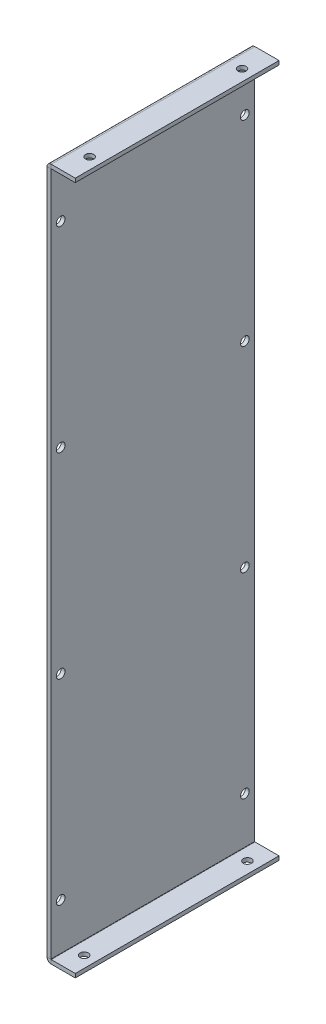
ISO-10303-21;
HEADER;
FILE_DESCRIPTION(('STEP AP214'),'2;1');
FILE_NAME('part.step','',(''),(''),'','','');
FILE_SCHEMA(('AUTOMOTIVE_DESIGN { 1 0 10303 214 1 1 1 1 }'));
ENDSEC;
DATA;
#1=APPLICATION_CONTEXT('core data for automotive mechanical design processes');
#2=APPLICATION_PROTOCOL_DEFINITION('international standard','automotive_design',2000,#1);
#3=PRODUCT_CONTEXT('',#1,'mechanical');
#4=PRODUCT('Part','Part','',(#3));
#5=PRODUCT_RELATED_PRODUCT_CATEGORY('part','',(#4));
#6=PRODUCT_DEFINITION_FORMATION('','',#4);
#7=PRODUCT_DEFINITION_CONTEXT('part definition',#1,'design');
#8=PRODUCT_DEFINITION('design','',#6,#7);
#9=PRODUCT_DEFINITION_SHAPE('','',#8);
#10=(LENGTH_UNIT() NAMED_UNIT(*) SI_UNIT(.MILLI.,.METRE.));
#11=(NAMED_UNIT(*) PLANE_ANGLE_UNIT() SI_UNIT($,.RADIAN.));
#12=(NAMED_UNIT(*) SI_UNIT($,.STERADIAN.) SOLID_ANGLE_UNIT());
#13=UNCERTAINTY_MEASURE_WITH_UNIT(LENGTH_MEASURE(1.E-05),#10,'distance_accuracy_value','');
#14=(GEOMETRIC_REPRESENTATION_CONTEXT(3) GLOBAL_UNCERTAINTY_ASSIGNED_CONTEXT((#13)) GLOBAL_UNIT_ASSIGNED_CONTEXT((#10,
#11,#12)) REPRESENTATION_CONTEXT('',''));
#15=CARTESIAN_POINT('',(0.,0.,0.));
#16=DIRECTION('',(0.,0.,1.));
#17=DIRECTION('',(1.,0.,0.));
#18=AXIS2_PLACEMENT_3D('',#15,#16,#17);
#19=CARTESIAN_POINT('',(0.,2.4384,118.872));
#20=DIRECTION('',(0.,0.,1.));
#21=DIRECTION('',(1.,0.,0.));
#22=AXIS2_PLACEMENT_3D('',#19,#20,#21);
#23=PLANE('',#22);
#24=DIRECTION('',(1.,0.,0.));
#25=VECTOR('',#24,1.);
#26=CARTESIAN_POINT('',(0.,2.4384,118.872));
#27=LINE('',#26,#25);
#28=CARTESIAN_POINT('',(0.,2.4384,118.872));
#29=VERTEX_POINT('',#28);
#30=CARTESIAN_POINT('',(2.286,2.4384,118.872));
#31=VERTEX_POINT('',#30);
#32=EDGE_CURVE('E11',#29,#31,#27,.T.);
#33=ORIENTED_EDGE('',*,*,#32,.F.);
#34=CARTESIAN_POINT('',(2.4384,2.4384,118.872));
#35=DIRECTION('',(0.,0.,1.));
#36=DIRECTION('',(1.,0.,0.));
#37=AXIS2_PLACEMENT_3D('',#34,#35,#36);
#38=CIRCLE('',#37,2.4384);
#39=CARTESIAN_POINT('',(2.4384,0.,118.872));
#40=VERTEX_POINT('',#39);
#41=EDGE_CURVE('E247',#40,#29,#38,.F.);
#42=ORIENTED_EDGE('',*,*,#41,.F.);
#43=DIRECTION('',(0.,-1.,0.));
#44=VECTOR('',#43,1.);
#45=CARTESIAN_POINT('',(2.4384,2.286,118.872));
#46=LINE('',#45,#44);
#47=CARTESIAN_POINT('',(2.4384,2.286,118.872));
#48=VERTEX_POINT('',#47);
#49=EDGE_CURVE('E44',#48,#40,#46,.T.);
#50=ORIENTED_EDGE('',*,*,#49,.F.);
#51=CARTESIAN_POINT('',(2.4384,2.4384,118.872));
#52=DIRECTION('',(0.,0.,1.));
#53=DIRECTION('',(1.,0.,0.));
#54=AXIS2_PLACEMENT_3D('',#51,#52,#53);
#55=CIRCLE('',#54,0.1524);
#56=EDGE_CURVE('E145',#48,#31,#55,.F.);
#57=ORIENTED_EDGE('',*,*,#56,.T.);
#58=EDGE_LOOP('',(#33,#42,#50,#57));
#59=FACE_BOUND('',#58,.T.);
#60=ADVANCED_FACE('F36',(#59),#23,.T.);
#61=CARTESIAN_POINT('',(2.4384,2.286,118.872));
#62=DIRECTION('',(0.,0.,1.));
#63=DIRECTION('',(1.,0.,0.));
#64=AXIS2_PLACEMENT_3D('',#61,#62,#63);
#65=PLANE('',#64);
#66=DIRECTION('',(0.,1.,0.));
#67=VECTOR('',#66,1.);
#68=CARTESIAN_POINT('',(0.,0.,118.872));
#69=LINE('',#68,#67);
#70=CARTESIAN_POINT('',(0.,401.6756,118.872));
#71=VERTEX_POINT('',#70);
#72=EDGE_CURVE('E139',#29,#71,#69,.T.);
#73=ORIENTED_EDGE('',*,*,#72,.F.);
#74=ORIENTED_EDGE('',*,*,#32,.T.);
#75=DIRECTION('',(0.,1.,0.));
#76=VECTOR('',#75,1.);
#77=CARTESIAN_POINT('',(2.286,0.,118.872));
#78=LINE('',#77,#76);
#79=CARTESIAN_POINT('',(2.286,401.6756,118.872));
#80=VERTEX_POINT('',#79);
#81=EDGE_CURVE('E136',#31,#80,#78,.T.);
#82=ORIENTED_EDGE('',*,*,#81,.T.);
#83=DIRECTION('',(-1.,0.,0.));
#84=VECTOR('',#83,1.);
#85=CARTESIAN_POINT('',(2.286,401.6756,118.872));
#86=LINE('',#85,#84);
#87=EDGE_CURVE('E228',#80,#71,#86,.T.);
#88=ORIENTED_EDGE('',*,*,#87,.T.);
#89=EDGE_LOOP('',(#73,#74,#82,#88));
#90=FACE_BOUND('',#89,.T.);
#91=ADVANCED_FACE('F134',(#90),#65,.T.);
#92=CARTESIAN_POINT('',(2.4384,0.,0.));
#93=DIRECTION('',(0.,0.,-1.));
#94=DIRECTION('',(-1.,0.,0.));
#95=AXIS2_PLACEMENT_3D('',#92,#93,#94);
#96=PLANE('',#95);
#97=DIRECTION('',(0.,1.,0.));
#98=VECTOR('',#97,1.);
#99=CARTESIAN_POINT('',(2.4384,0.,0.));
#100=LINE('',#99,#98);
#101=CARTESIAN_POINT('',(2.4384,0.,0.));
#102=VERTEX_POINT('',#101);
#103=CARTESIAN_POINT('',(2.4384,2.286,0.));
#104=VERTEX_POINT('',#103);
#105=EDGE_CURVE('E233',#102,#104,#100,.T.);
#106=ORIENTED_EDGE('',*,*,#105,.F.);
#107=CARTESIAN_POINT('',(2.4384,2.4384,0.));
#108=DIRECTION('',(0.,0.,1.));
#109=DIRECTION('',(1.,0.,0.));
#110=AXIS2_PLACEMENT_3D('',#107,#108,#109);
#111=CIRCLE('',#110,2.4384);
#112=CARTESIAN_POINT('',(0.,2.4384,0.));
#113=VERTEX_POINT('',#112);
#114=EDGE_CURVE('E185',#102,#113,#111,.F.);
#115=ORIENTED_EDGE('',*,*,#114,.T.);
#116=DIRECTION('',(-1.,0.,0.));
#117=VECTOR('',#116,1.);
#118=CARTESIAN_POINT('',(2.286,2.4384,0.));
#119=LINE('',#118,#117);
#120=CARTESIAN_POINT('',(2.286,2.4384,0.));
#121=VERTEX_POINT('',#120);
#122=EDGE_CURVE('E231',#121,#113,#119,.T.);
#123=ORIENTED_EDGE('',*,*,#122,.F.);
#124=CARTESIAN_POINT('',(2.4384,2.4384,0.));
#125=DIRECTION('',(0.,0.,1.));
#126=DIRECTION('',(1.,0.,0.));
#127=AXIS2_PLACEMENT_3D('',#124,#125,#126);
#128=CIRCLE('',#127,0.1524);
#129=EDGE_CURVE('E157',#104,#121,#128,.F.);
#130=ORIENTED_EDGE('',*,*,#129,.F.);
#131=EDGE_LOOP('',(#106,#115,#123,#130));
#132=FACE_BOUND('',#131,.T.);
#133=ADVANCED_FACE('F371',(#132),#96,.T.);
#134=CARTESIAN_POINT('',(2.286,2.4384,0.));
#135=DIRECTION('',(0.,0.,-1.));
#136=DIRECTION('',(-1.,0.,0.));
#137=AXIS2_PLACEMENT_3D('',#134,#135,#136);
#138=PLANE('',#137);
#139=DIRECTION('',(-1.,0.,0.));
#140=VECTOR('',#139,1.);
#141=CARTESIAN_POINT('',(0.,0.,0.));
#142=LINE('',#141,#140);
#143=CARTESIAN_POINT('',(16.51,0.,0.));
#144=VERTEX_POINT('',#143);
#145=EDGE_CURVE('E188',#144,#102,#142,.T.);
#146=ORIENTED_EDGE('',*,*,#145,.T.);
#147=ORIENTED_EDGE('',*,*,#105,.T.);
#148=DIRECTION('',(1.,0.,0.));
#149=VECTOR('',#148,1.);
#150=CARTESIAN_POINT('',(0.,2.286,0.));
#151=LINE('',#150,#149);
#152=CARTESIAN_POINT('',(16.51,2.286,0.));
#153=VERTEX_POINT('',#152);
#154=EDGE_CURVE('E194',#153,#104,#151,.F.);
#155=ORIENTED_EDGE('',*,*,#154,.F.);
#156=DIRECTION('',(0.,-1.,0.));
#157=VECTOR('',#156,1.);
#158=CARTESIAN_POINT('',(16.51,2.286,0.));
#159=LINE('',#158,#157);
#160=EDGE_CURVE('E191',#153,#144,#159,.T.);
#161=ORIENTED_EDGE('',*,*,#160,.T.);
#162=EDGE_LOOP('',(#146,#147,#155,#161));
#163=FACE_BOUND('',#162,.T.);
#164=ADVANCED_FACE('F374',(#163),#138,.T.);
#165=CARTESIAN_POINT('',(2.4384,404.114,118.872));
#166=DIRECTION('',(0.,0.,1.));
#167=DIRECTION('',(1.,0.,0.));
#168=AXIS2_PLACEMENT_3D('',#165,#166,#167);
#169=PLANE('',#168);
#170=DIRECTION('',(0.,-1.,0.));
#171=VECTOR('',#170,1.);
#172=CARTESIAN_POINT('',(2.4384,404.114,118.872));
#173=LINE('',#172,#171);
#174=CARTESIAN_POINT('',(2.4384,404.114,118.872));
#175=VERTEX_POINT('',#174);
#176=CARTESIAN_POINT('',(2.4384,401.828,118.872));
#177=VERTEX_POINT('',#176);
#178=EDGE_CURVE('E52',#175,#177,#173,.T.);
#179=ORIENTED_EDGE('',*,*,#178,.F.);
#180=CARTESIAN_POINT('',(2.4384,401.6756,118.872));
#181=DIRECTION('',(0.,0.,1.));
#182=DIRECTION('',(1.,0.,0.));
#183=AXIS2_PLACEMENT_3D('',#180,#181,#182);
#184=CIRCLE('',#183,2.4384);
#185=EDGE_CURVE('E257',#71,#175,#184,.F.);
#186=ORIENTED_EDGE('',*,*,#185,.F.);
#187=ORIENTED_EDGE('',*,*,#87,.F.);
#188=CARTESIAN_POINT('',(2.4384,401.6756,118.872));
#189=DIRECTION('',(0.,0.,1.));
#190=DIRECTION('',(1.,0.,0.));
#191=AXIS2_PLACEMENT_3D('',#188,#189,#190);
#192=CIRCLE('',#191,0.1524);
#193=EDGE_CURVE('E165',#80,#177,#192,.F.);
#194=ORIENTED_EDGE('',*,*,#193,.T.);
#195=EDGE_LOOP('',(#179,#186,#187,#194));
#196=FACE_BOUND('',#195,.T.);
#197=ADVANCED_FACE('F401',(#196),#169,.T.);
#198=CARTESIAN_POINT('',(2.286,401.6756,118.872));
#199=DIRECTION('',(0.,0.,1.));
#200=DIRECTION('',(1.,0.,0.));
#201=AXIS2_PLACEMENT_3D('',#198,#199,#200);
#202=PLANE('',#201);
#203=DIRECTION('',(1.,0.,0.));
#204=VECTOR('',#203,1.);
#205=CARTESIAN_POINT('',(0.,404.114,118.872));
#206=LINE('',#205,#204);
#207=CARTESIAN_POINT('',(16.51,404.114,118.872));
#208=VERTEX_POINT('',#207);
#209=EDGE_CURVE('E260',#175,#208,#206,.T.);
#210=ORIENTED_EDGE('',*,*,#209,.F.);
#211=ORIENTED_EDGE('',*,*,#178,.T.);
#212=DIRECTION('',(1.,0.,0.));
#213=VECTOR('',#212,1.);
#214=CARTESIAN_POINT('',(0.,401.828,118.872));
#215=LINE('',#214,#213);
#216=CARTESIAN_POINT('',(16.51,401.828,118.872));
#217=VERTEX_POINT('',#216);
#218=EDGE_CURVE('E106',#177,#217,#215,.T.);
#219=ORIENTED_EDGE('',*,*,#218,.T.);
#220=DIRECTION('',(0.,-1.,0.));
#221=VECTOR('',#220,1.);
#222=CARTESIAN_POINT('',(16.51,404.114,118.872));
#223=LINE('',#222,#221);
#224=EDGE_CURVE('E263',#208,#217,#223,.T.);
#225=ORIENTED_EDGE('',*,*,#224,.F.);
#226=EDGE_LOOP('',(#210,#211,#219,#225));
#227=FACE_BOUND('',#226,.T.);
#228=ADVANCED_FACE('F404',(#227),#202,.T.);
#229=CARTESIAN_POINT('',(0.,401.6756,0.));
#230=DIRECTION('',(0.,0.,-1.));
#231=DIRECTION('',(-1.,0.,0.));
#232=AXIS2_PLACEMENT_3D('',#229,#230,#231);
#233=PLANE('',#232);
#234=DIRECTION('',(1.,0.,0.));
#235=VECTOR('',#234,1.);
#236=CARTESIAN_POINT('',(0.,401.6756,0.));
#237=LINE('',#236,#235);
#238=CARTESIAN_POINT('',(0.,401.6756,0.));
#239=VERTEX_POINT('',#238);
#240=CARTESIAN_POINT('',(2.286,401.6756,0.));
#241=VERTEX_POINT('',#240);
#242=EDGE_CURVE('E93',#239,#241,#237,.T.);
#243=ORIENTED_EDGE('',*,*,#242,.F.);
#244=CARTESIAN_POINT('',(2.4384,401.6756,0.));
#245=DIRECTION('',(0.,0.,1.));
#246=DIRECTION('',(1.,0.,0.));
#247=AXIS2_PLACEMENT_3D('',#244,#245,#246);
#248=CIRCLE('',#247,2.4384);
#249=CARTESIAN_POINT('',(2.4384,404.114,0.));
#250=VERTEX_POINT('',#249);
#251=EDGE_CURVE('E181',#239,#250,#248,.F.);
#252=ORIENTED_EDGE('',*,*,#251,.T.);
#253=DIRECTION('',(0.,1.,0.));
#254=VECTOR('',#253,1.);
#255=CARTESIAN_POINT('',(2.4384,401.828,0.));
#256=LINE('',#255,#254);
#257=CARTESIAN_POINT('',(2.4384,401.828,0.));
#258=VERTEX_POINT('',#257);
#259=EDGE_CURVE('E100',#258,#250,#256,.T.);
#260=ORIENTED_EDGE('',*,*,#259,.F.);
#261=CARTESIAN_POINT('',(2.4384,401.6756,0.));
#262=DIRECTION('',(0.,0.,1.));
#263=DIRECTION('',(1.,0.,0.));
#264=AXIS2_PLACEMENT_3D('',#261,#262,#263);
#265=CIRCLE('',#264,0.1524);
#266=EDGE_CURVE('E200',#241,#258,#265,.F.);
#267=ORIENTED_EDGE('',*,*,#266,.F.);
#268=EDGE_LOOP('',(#243,#252,#260,#267));
#269=FACE_BOUND('',#268,.T.);
#270=ADVANCED_FACE('F362',(#269),#233,.T.);
#271=CARTESIAN_POINT('',(2.4384,401.828,0.));
#272=DIRECTION('',(0.,0.,-1.));
#273=DIRECTION('',(-1.,0.,0.));
#274=AXIS2_PLACEMENT_3D('',#271,#272,#273);
#275=PLANE('',#274);
#276=DIRECTION('',(0.,1.,0.));
#277=VECTOR('',#276,1.);
#278=CARTESIAN_POINT('',(0.,0.,0.));
#279=LINE('',#278,#277);
#280=EDGE_CURVE('E183',#113,#239,#279,.T.);
#281=ORIENTED_EDGE('',*,*,#280,.T.);
#282=ORIENTED_EDGE('',*,*,#242,.T.);
#283=DIRECTION('',(0.,1.,0.));
#284=VECTOR('',#283,1.);
#285=CARTESIAN_POINT('',(2.286,0.,0.));
#286=LINE('',#285,#284);
#287=EDGE_CURVE('E198',#121,#241,#286,.T.);
#288=ORIENTED_EDGE('',*,*,#287,.F.);
#289=ORIENTED_EDGE('',*,*,#122,.T.);
#290=EDGE_LOOP('',(#281,#282,#288,#289));
#291=FACE_BOUND('',#290,.T.);
#292=ADVANCED_FACE('F367',(#291),#275,.T.);
#293=CARTESIAN_POINT('',(0.,401.828,118.872));
#294=DIRECTION('',(0.,1.,0.));
#295=DIRECTION('',(0.,0.,1.));
#296=AXIS2_PLACEMENT_3D('',#293,#294,#295);
#297=PLANE('',#296);
#298=CARTESIAN_POINT('',(9.906,401.828,14.986));
#299=DIRECTION('',(0.,1.,0.));
#300=DIRECTION('',(0.,0.,1.));
#301=AXIS2_PLACEMENT_3D('',#298,#299,#300);
#302=CIRCLE('',#301,2.38125);
#303=CARTESIAN_POINT('',(9.906,401.828,17.36725));
#304=VERTEX_POINT('',#303);
#305=EDGE_CURVE('E330',#304,#304,#302,.T.);
#306=ORIENTED_EDGE('',*,*,#305,.T.);
#307=EDGE_LOOP('',(#306));
#308=FACE_BOUND('',#307,.T.);
#309=CARTESIAN_POINT('',(9.906,401.828,103.886));
#310=DIRECTION('',(0.,1.,0.));
#311=DIRECTION('',(0.,0.,1.));
#312=AXIS2_PLACEMENT_3D('',#309,#310,#311);
#313=CIRCLE('',#312,2.38125);
#314=CARTESIAN_POINT('',(9.906,401.828,106.26725));
#315=VERTEX_POINT('',#314);
#316=EDGE_CURVE('E324',#315,#315,#313,.T.);
#317=ORIENTED_EDGE('',*,*,#316,.T.);
#318=EDGE_LOOP('',(#317));
#319=FACE_BOUND('',#318,.T.);
#320=DIRECTION('',(1.,0.,0.));
#321=VECTOR('',#320,1.);
#322=CARTESIAN_POINT('',(0.,401.828,0.));
#323=LINE('',#322,#321);
#324=CARTESIAN_POINT('',(16.51,401.828,0.));
#325=VERTEX_POINT('',#324);
#326=EDGE_CURVE('E171',#258,#325,#323,.T.);
#327=ORIENTED_EDGE('',*,*,#326,.T.);
#328=DIRECTION('',(0.,0.,-1.));
#329=VECTOR('',#328,1.);
#330=CARTESIAN_POINT('',(16.51,401.828,118.872));
#331=LINE('',#330,#329);
#332=EDGE_CURVE('E224',#217,#325,#331,.T.);
#333=ORIENTED_EDGE('',*,*,#332,.F.);
#334=ORIENTED_EDGE('',*,*,#218,.F.);
#335=DIRECTION('',(0.,0.,-1.));
#336=VECTOR('',#335,1.);
#337=CARTESIAN_POINT('',(2.4384,401.828,118.872));
#338=LINE('',#337,#336);
#339=EDGE_CURVE('E167',#177,#258,#338,.T.);
#340=ORIENTED_EDGE('',*,*,#339,.T.);
#341=EDGE_LOOP('',(#327,#333,#334,#340));
#342=FACE_BOUND('',#341,.T.);
#343=ADVANCED_FACE('F339',(#308,#319,#342),#297,.F.);
#344=CARTESIAN_POINT('',(16.51,404.114,118.872));
#345=DIRECTION('',(1.,0.,0.));
#346=DIRECTION('',(0.,0.,-1.));
#347=AXIS2_PLACEMENT_3D('',#344,#345,#346);
#348=PLANE('',#347);
#349=DIRECTION('',(0.,-1.,0.));
#350=VECTOR('',#349,1.);
#351=CARTESIAN_POINT('',(16.51,404.114,0.));
#352=LINE('',#351,#350);
#353=CARTESIAN_POINT('',(16.51,404.114,0.));
#354=VERTEX_POINT('',#353);
#355=EDGE_CURVE('E174',#354,#325,#352,.T.);
#356=ORIENTED_EDGE('',*,*,#355,.F.);
#357=DIRECTION('',(0.,0.,-1.));
#358=VECTOR('',#357,1.);
#359=CARTESIAN_POINT('',(16.51,404.114,118.872));
#360=LINE('',#359,#358);
#361=EDGE_CURVE('E222',#208,#354,#360,.T.);
#362=ORIENTED_EDGE('',*,*,#361,.F.);
#363=ORIENTED_EDGE('',*,*,#224,.T.);
#364=ORIENTED_EDGE('',*,*,#332,.T.);
#365=EDGE_LOOP('',(#356,#362,#363,#364));
#366=FACE_BOUND('',#365,.T.);
#367=ADVANCED_FACE('F353',(#366),#348,.T.);
#368=CARTESIAN_POINT('',(0.,404.114,118.872));
#369=DIRECTION('',(0.,1.,0.));
#370=DIRECTION('',(0.,0.,1.));
#371=AXIS2_PLACEMENT_3D('',#368,#369,#370);
#372=PLANE('',#371);
#373=CARTESIAN_POINT('',(9.906,404.114,14.986));
#374=DIRECTION('',(0.,1.,0.));
#375=DIRECTION('',(0.,0.,1.));
#376=AXIS2_PLACEMENT_3D('',#373,#374,#375);
#377=CIRCLE('',#376,2.38125);
#378=CARTESIAN_POINT('',(9.906,404.114,17.36725));
#379=VERTEX_POINT('',#378);
#380=EDGE_CURVE('E333',#379,#379,#377,.T.);
#381=ORIENTED_EDGE('',*,*,#380,.F.);
#382=EDGE_LOOP('',(#381));
#383=FACE_BOUND('',#382,.T.);
#384=CARTESIAN_POINT('',(9.906,404.114,103.886));
#385=DIRECTION('',(0.,1.,0.));
#386=DIRECTION('',(0.,0.,1.));
#387=AXIS2_PLACEMENT_3D('',#384,#385,#386);
#388=CIRCLE('',#387,2.38125);
#389=CARTESIAN_POINT('',(9.906,404.114,106.26725));
#390=VERTEX_POINT('',#389);
#391=EDGE_CURVE('E327',#390,#390,#388,.T.);
#392=ORIENTED_EDGE('',*,*,#391,.F.);
#393=EDGE_LOOP('',(#392));
#394=FACE_BOUND('',#393,.T.);
#395=DIRECTION('',(1.,0.,0.));
#396=VECTOR('',#395,1.);
#397=CARTESIAN_POINT('',(0.,404.114,0.));
#398=LINE('',#397,#396);
#399=EDGE_CURVE('E178',#250,#354,#398,.T.);
#400=ORIENTED_EDGE('',*,*,#399,.F.);
#401=DIRECTION('',(0.,0.,-1.));
#402=VECTOR('',#401,1.);
#403=CARTESIAN_POINT('',(2.4384,404.114,118.872));
#404=LINE('',#403,#402);
#405=EDGE_CURVE('E219',#175,#250,#404,.T.);
#406=ORIENTED_EDGE('',*,*,#405,.F.);
#407=ORIENTED_EDGE('',*,*,#209,.T.);
#408=ORIENTED_EDGE('',*,*,#361,.T.);
#409=EDGE_LOOP('',(#400,#406,#407,#408));
#410=FACE_BOUND('',#409,.T.);
#411=ADVANCED_FACE('F349',(#383,#394,#410),#372,.T.);
#412=CARTESIAN_POINT('',(2.4384,401.6756,118.872));
#413=DIRECTION('',(0.,0.,-1.));
#414=DIRECTION('',(-1.,0.,0.));
#415=AXIS2_PLACEMENT_3D('',#412,#413,#414);
#416=CYLINDRICAL_SURFACE('',#415,2.4384);
#417=ORIENTED_EDGE('',*,*,#251,.F.);
#418=DIRECTION('',(0.,0.,-1.));
#419=VECTOR('',#418,1.);
#420=CARTESIAN_POINT('',(0.,401.6756,118.872));
#421=LINE('',#420,#419);
#422=EDGE_CURVE('E216',#71,#239,#421,.T.);
#423=ORIENTED_EDGE('',*,*,#422,.F.);
#424=ORIENTED_EDGE('',*,*,#185,.T.);
#425=ORIENTED_EDGE('',*,*,#405,.T.);
#426=EDGE_LOOP('',(#417,#423,#424,#425));
#427=FACE_BOUND('',#426,.T.);
#428=ADVANCED_FACE('F352',(#427),#416,.T.);
#429=CARTESIAN_POINT('',(0.,0.,118.872));
#430=DIRECTION('',(-1.,0.,0.));
#431=DIRECTION('',(0.,0.,1.));
#432=AXIS2_PLACEMENT_3D('',#429,#430,#431);
#433=PLANE('',#432);
#434=CARTESIAN_POINT('',(0.,29.464,113.157000000004));
#435=DIRECTION('',(-1.,0.,0.));
#436=DIRECTION('',(0.,0.,1.));
#437=AXIS2_PLACEMENT_3D('',#434,#435,#436);
#438=CIRCLE('',#437,2.53999999999987);
#439=CARTESIAN_POINT('',(0.,29.464,115.697000000003));
#440=VERTEX_POINT('',#439);
#441=EDGE_CURVE('E309',#440,#440,#438,.T.);
#442=ORIENTED_EDGE('',*,*,#441,.F.);
#443=EDGE_LOOP('',(#442));
#444=FACE_BOUND('',#443,.T.);
#445=CARTESIAN_POINT('',(0.,29.464,5.71500000000359));
#446=DIRECTION('',(-1.,0.,0.));
#447=DIRECTION('',(0.,0.,1.));
#448=AXIS2_PLACEMENT_3D('',#445,#446,#447);
#449=CIRCLE('',#448,2.53999999999997);
#450=CARTESIAN_POINT('',(0.,29.464,8.25500000000356));
#451=VERTEX_POINT('',#450);
#452=EDGE_CURVE('E303',#451,#451,#449,.T.);
#453=ORIENTED_EDGE('',*,*,#452,.F.);
#454=EDGE_LOOP('',(#453));
#455=FACE_BOUND('',#454,.T.);
#456=CARTESIAN_POINT('',(0.,372.364,113.157));
#457=DIRECTION('',(-1.,0.,0.));
#458=DIRECTION('',(0.,0.,1.));
#459=AXIS2_PLACEMENT_3D('',#456,#457,#458);
#460=CIRCLE('',#459,2.53999999999986);
#461=CARTESIAN_POINT('',(0.,372.364,115.697));
#462=VERTEX_POINT('',#461);
#463=EDGE_CURVE('E297',#462,#462,#460,.T.);
#464=ORIENTED_EDGE('',*,*,#463,.F.);
#465=EDGE_LOOP('',(#464));
#466=FACE_BOUND('',#465,.T.);
#467=CARTESIAN_POINT('',(0.,372.364,5.715));
#468=DIRECTION('',(-1.,0.,0.));
#469=DIRECTION('',(0.,0.,1.));
#470=AXIS2_PLACEMENT_3D('',#467,#468,#469);
#471=CIRCLE('',#470,2.53999999999991);
#472=CARTESIAN_POINT('',(0.,372.364,8.2549999999999));
#473=VERTEX_POINT('',#472);
#474=EDGE_CURVE('E291',#473,#473,#471,.T.);
#475=ORIENTED_EDGE('',*,*,#474,.F.);
#476=EDGE_LOOP('',(#475));
#477=FACE_BOUND('',#476,.T.);
#478=CARTESIAN_POINT('',(0.,143.764,113.157000000002));
#479=DIRECTION('',(-1.,0.,0.));
#480=DIRECTION('',(0.,0.,1.));
#481=AXIS2_PLACEMENT_3D('',#478,#479,#480);
#482=CIRCLE('',#481,2.53999999999986);
#483=CARTESIAN_POINT('',(0.,143.764,115.697000000002));
#484=VERTEX_POINT('',#483);
#485=EDGE_CURVE('E285',#484,#484,#482,.T.);
#486=ORIENTED_EDGE('',*,*,#485,.F.);
#487=EDGE_LOOP('',(#486));
#488=FACE_BOUND('',#487,.T.);
#489=CARTESIAN_POINT('',(0.,143.764,5.71500000000239));
#490=DIRECTION('',(-1.,0.,0.));
#491=DIRECTION('',(0.,0.,1.));
#492=AXIS2_PLACEMENT_3D('',#489,#490,#491);
#493=CIRCLE('',#492,2.53999999999996);
#494=CARTESIAN_POINT('',(0.,143.764,8.25500000000236));
#495=VERTEX_POINT('',#494);
#496=EDGE_CURVE('E279',#495,#495,#493,.T.);
#497=ORIENTED_EDGE('',*,*,#496,.F.);
#498=EDGE_LOOP('',(#497));
#499=FACE_BOUND('',#498,.T.);
#500=CARTESIAN_POINT('',(0.,258.064,113.157000000001));
#501=DIRECTION('',(-1.,0.,0.));
#502=DIRECTION('',(0.,0.,1.));
#503=AXIS2_PLACEMENT_3D('',#500,#501,#502);
#504=CIRCLE('',#503,2.53999999999986);
#505=CARTESIAN_POINT('',(0.,258.064,115.697000000001));
#506=VERTEX_POINT('',#505);
#507=EDGE_CURVE('E273',#506,#506,#504,.T.);
#508=ORIENTED_EDGE('',*,*,#507,.F.);
#509=EDGE_LOOP('',(#508));
#510=FACE_BOUND('',#509,.T.);
#511=CARTESIAN_POINT('',(0.,258.064,5.71500000000119));
#512=DIRECTION('',(-1.,0.,0.));
#513=DIRECTION('',(0.,0.,1.));
#514=AXIS2_PLACEMENT_3D('',#511,#512,#513);
#515=CIRCLE('',#514,2.53999999999998);
#516=CARTESIAN_POINT('',(0.,258.064,8.25500000000118));
#517=VERTEX_POINT('',#516);
#518=EDGE_CURVE('E267',#517,#517,#515,.T.);
#519=ORIENTED_EDGE('',*,*,#518,.F.);
#520=EDGE_LOOP('',(#519));
#521=FACE_BOUND('',#520,.T.);
#522=ORIENTED_EDGE('',*,*,#280,.F.);
#523=DIRECTION('',(0.,0.,-1.));
#524=VECTOR('',#523,1.);
#525=CARTESIAN_POINT('',(0.,2.4384,118.872));
#526=LINE('',#525,#524);
#527=EDGE_CURVE('E213',#29,#113,#526,.T.);
#528=ORIENTED_EDGE('',*,*,#527,.F.);
#529=ORIENTED_EDGE('',*,*,#72,.T.);
#530=ORIENTED_EDGE('',*,*,#422,.T.);
#531=EDGE_LOOP('',(#522,#528,#529,#530));
#532=FACE_BOUND('',#531,.T.);
#533=ADVANCED_FACE('F369',(#444,#455,#466,#477,#488,#499,#510,#521,#532),#433,.T.);
#534=CARTESIAN_POINT('',(2.4384,2.4384,118.872));
#535=DIRECTION('',(0.,0.,-1.));
#536=DIRECTION('',(-1.,0.,0.));
#537=AXIS2_PLACEMENT_3D('',#534,#535,#536);
#538=CYLINDRICAL_SURFACE('',#537,2.4384);
#539=ORIENTED_EDGE('',*,*,#114,.F.);
#540=DIRECTION('',(0.,0.,-1.));
#541=VECTOR('',#540,1.);
#542=CARTESIAN_POINT('',(2.4384,0.,118.872));
#543=LINE('',#542,#541);
#544=EDGE_CURVE('E210',#40,#102,#543,.T.);
#545=ORIENTED_EDGE('',*,*,#544,.F.);
#546=ORIENTED_EDGE('',*,*,#41,.T.);
#547=ORIENTED_EDGE('',*,*,#527,.T.);
#548=EDGE_LOOP('',(#539,#545,#546,#547));
#549=FACE_BOUND('',#548,.T.);
#550=ADVANCED_FACE('F246',(#549),#538,.T.);
#551=CARTESIAN_POINT('',(0.,0.,118.872));
#552=DIRECTION('',(0.,-1.,0.));
#553=DIRECTION('',(0.,0.,-1.));
#554=AXIS2_PLACEMENT_3D('',#551,#552,#553);
#555=PLANE('',#554);
#556=CARTESIAN_POINT('',(9.906000000001,0.,11.811));
#557=DIRECTION('',(0.,-1.,0.));
#558=DIRECTION('',(0.,0.,-1.));
#559=AXIS2_PLACEMENT_3D('',#556,#557,#558);
#560=CIRCLE('',#559,2.3876);
#561=CARTESIAN_POINT('',(9.906000000001,0.,9.42339999999998));
#562=VERTEX_POINT('',#561);
#563=EDGE_CURVE('E321',#562,#562,#560,.T.);
#564=ORIENTED_EDGE('',*,*,#563,.F.);
#565=EDGE_LOOP('',(#564));
#566=FACE_BOUND('',#565,.T.);
#567=CARTESIAN_POINT('',(9.906,0.,107.061));
#568=DIRECTION('',(0.,-1.,0.));
#569=DIRECTION('',(0.,0.,-1.));
#570=AXIS2_PLACEMENT_3D('',#567,#568,#569);
#571=CIRCLE('',#570,2.38760000000002);
#572=CARTESIAN_POINT('',(9.906,0.,104.6734));
#573=VERTEX_POINT('',#572);
#574=EDGE_CURVE('E315',#573,#573,#571,.T.);
#575=ORIENTED_EDGE('',*,*,#574,.F.);
#576=EDGE_LOOP('',(#575));
#577=FACE_BOUND('',#576,.T.);
#578=ORIENTED_EDGE('',*,*,#145,.F.);
#579=DIRECTION('',(0.,0.,-1.));
#580=VECTOR('',#579,1.);
#581=CARTESIAN_POINT('',(16.51,0.,118.872));
#582=LINE('',#581,#580);
#583=CARTESIAN_POINT('',(16.51,0.,118.872));
#584=VERTEX_POINT('',#583);
#585=EDGE_CURVE('E208',#584,#144,#582,.T.);
#586=ORIENTED_EDGE('',*,*,#585,.F.);
#587=DIRECTION('',(-1.,0.,0.));
#588=VECTOR('',#587,1.);
#589=CARTESIAN_POINT('',(0.,0.,118.872));
#590=LINE('',#589,#588);
#591=EDGE_CURVE('E240',#584,#40,#590,.T.);
#592=ORIENTED_EDGE('',*,*,#591,.T.);
#593=ORIENTED_EDGE('',*,*,#544,.T.);
#594=EDGE_LOOP('',(#578,#586,#592,#593));
#595=FACE_BOUND('',#594,.T.);
#596=ADVANCED_FACE('F251',(#566,#577,#595),#555,.T.);
#597=CARTESIAN_POINT('',(16.51,2.286,118.872));
#598=DIRECTION('',(1.,0.,0.));
#599=DIRECTION('',(0.,0.,-1.));
#600=AXIS2_PLACEMENT_3D('',#597,#598,#599);
#601=PLANE('',#600);
#602=ORIENTED_EDGE('',*,*,#160,.F.);
#603=DIRECTION('',(0.,0.,-1.));
#604=VECTOR('',#603,1.);
#605=CARTESIAN_POINT('',(16.51,2.286,118.872));
#606=LINE('',#605,#604);
#607=CARTESIAN_POINT('',(16.51,2.286,118.872));
#608=VERTEX_POINT('',#607);
#609=EDGE_CURVE('E206',#608,#153,#606,.T.);
#610=ORIENTED_EDGE('',*,*,#609,.F.);
#611=DIRECTION('',(0.,-1.,0.));
#612=VECTOR('',#611,1.);
#613=CARTESIAN_POINT('',(16.51,2.286,118.872));
#614=LINE('',#613,#612);
#615=EDGE_CURVE('E252',#608,#584,#614,.T.);
#616=ORIENTED_EDGE('',*,*,#615,.T.);
#617=ORIENTED_EDGE('',*,*,#585,.T.);
#618=EDGE_LOOP('',(#602,#610,#616,#617));
#619=FACE_BOUND('',#618,.T.);
#620=ADVANCED_FACE('F379',(#619),#601,.T.);
#621=CARTESIAN_POINT('',(0.,2.286,118.872));
#622=DIRECTION('',(0.,-1.,0.));
#623=DIRECTION('',(0.,0.,-1.));
#624=AXIS2_PLACEMENT_3D('',#621,#622,#623);
#625=PLANE('',#624);
#626=CARTESIAN_POINT('',(9.906000000001,2.286,11.811));
#627=DIRECTION('',(0.,-1.,0.));
#628=DIRECTION('',(0.,0.,-1.));
#629=AXIS2_PLACEMENT_3D('',#626,#627,#628);
#630=CIRCLE('',#629,2.3876);
#631=CARTESIAN_POINT('',(9.906000000001,2.286,9.42339999999998));
#632=VERTEX_POINT('',#631);
#633=EDGE_CURVE('E318',#632,#632,#630,.T.);
#634=ORIENTED_EDGE('',*,*,#633,.T.);
#635=EDGE_LOOP('',(#634));
#636=FACE_BOUND('',#635,.T.);
#637=CARTESIAN_POINT('',(9.906,2.286,107.061));
#638=DIRECTION('',(0.,-1.,0.));
#639=DIRECTION('',(0.,0.,-1.));
#640=AXIS2_PLACEMENT_3D('',#637,#638,#639);
#641=CIRCLE('',#640,2.38760000000002);
#642=CARTESIAN_POINT('',(9.906,2.286,104.6734));
#643=VERTEX_POINT('',#642);
#644=EDGE_CURVE('E312',#643,#643,#641,.T.);
#645=ORIENTED_EDGE('',*,*,#644,.T.);
#646=EDGE_LOOP('',(#645));
#647=FACE_BOUND('',#646,.T.);
#648=ORIENTED_EDGE('',*,*,#154,.T.);
#649=DIRECTION('',(0.,0.,-1.));
#650=VECTOR('',#649,1.);
#651=CARTESIAN_POINT('',(2.4384,2.286,118.872));
#652=LINE('',#651,#650);
#653=EDGE_CURVE('E159',#48,#104,#652,.T.);
#654=ORIENTED_EDGE('',*,*,#653,.F.);
#655=DIRECTION('',(1.,0.,0.));
#656=VECTOR('',#655,1.);
#657=CARTESIAN_POINT('',(0.,2.286,118.872));
#658=LINE('',#657,#656);
#659=EDGE_CURVE('E150',#608,#48,#658,.F.);
#660=ORIENTED_EDGE('',*,*,#659,.F.);
#661=ORIENTED_EDGE('',*,*,#609,.T.);
#662=EDGE_LOOP('',(#648,#654,#660,#661));
#663=FACE_BOUND('',#662,.T.);
#664=ADVANCED_FACE('F377',(#636,#647,#663),#625,.F.);
#665=CARTESIAN_POINT('',(2.4384,2.4384,118.872));
#666=DIRECTION('',(0.,0.,-1.));
#667=DIRECTION('',(-1.,0.,0.));
#668=AXIS2_PLACEMENT_3D('',#665,#666,#667);
#669=CYLINDRICAL_SURFACE('',#668,0.1524);
#670=ORIENTED_EDGE('',*,*,#129,.T.);
#671=DIRECTION('',(0.,0.,-1.));
#672=VECTOR('',#671,1.);
#673=CARTESIAN_POINT('',(2.286,2.4384,118.872));
#674=LINE('',#673,#672);
#675=EDGE_CURVE('E154',#31,#121,#674,.T.);
#676=ORIENTED_EDGE('',*,*,#675,.F.);
#677=ORIENTED_EDGE('',*,*,#56,.F.);
#678=ORIENTED_EDGE('',*,*,#653,.T.);
#679=EDGE_LOOP('',(#670,#676,#677,#678));
#680=FACE_BOUND('',#679,.T.);
#681=ADVANCED_FACE('F155',(#680),#669,.F.);
#682=CARTESIAN_POINT('',(2.286,0.,118.872));
#683=DIRECTION('',(-1.,0.,0.));
#684=DIRECTION('',(0.,0.,1.));
#685=AXIS2_PLACEMENT_3D('',#682,#683,#684);
#686=PLANE('',#685);
#687=CARTESIAN_POINT('',(2.286,29.464,113.157000000004));
#688=DIRECTION('',(-1.,0.,0.));
#689=DIRECTION('',(0.,0.,1.));
#690=AXIS2_PLACEMENT_3D('',#687,#688,#689);
#691=CIRCLE('',#690,2.53999999999987);
#692=CARTESIAN_POINT('',(2.286,29.464,115.697000000003));
#693=VERTEX_POINT('',#692);
#694=EDGE_CURVE('E306',#693,#693,#691,.T.);
#695=ORIENTED_EDGE('',*,*,#694,.T.);
#696=EDGE_LOOP('',(#695));
#697=FACE_BOUND('',#696,.T.);
#698=CARTESIAN_POINT('',(2.286,29.464,5.71500000000359));
#699=DIRECTION('',(-1.,0.,0.));
#700=DIRECTION('',(0.,0.,1.));
#701=AXIS2_PLACEMENT_3D('',#698,#699,#700);
#702=CIRCLE('',#701,2.53999999999997);
#703=CARTESIAN_POINT('',(2.286,29.464,8.25500000000356));
#704=VERTEX_POINT('',#703);
#705=EDGE_CURVE('E300',#704,#704,#702,.T.);
#706=ORIENTED_EDGE('',*,*,#705,.T.);
#707=EDGE_LOOP('',(#706));
#708=FACE_BOUND('',#707,.T.);
#709=CARTESIAN_POINT('',(2.286,372.364,113.157));
#710=DIRECTION('',(-1.,0.,0.));
#711=DIRECTION('',(0.,0.,1.));
#712=AXIS2_PLACEMENT_3D('',#709,#710,#711);
#713=CIRCLE('',#712,2.53999999999986);
#714=CARTESIAN_POINT('',(2.286,372.364,115.697));
#715=VERTEX_POINT('',#714);
#716=EDGE_CURVE('E294',#715,#715,#713,.T.);
#717=ORIENTED_EDGE('',*,*,#716,.T.);
#718=EDGE_LOOP('',(#717));
#719=FACE_BOUND('',#718,.T.);
#720=CARTESIAN_POINT('',(2.286,372.364,5.715));
#721=DIRECTION('',(-1.,0.,0.));
#722=DIRECTION('',(0.,0.,1.));
#723=AXIS2_PLACEMENT_3D('',#720,#721,#722);
#724=CIRCLE('',#723,2.53999999999991);
#725=CARTESIAN_POINT('',(2.286,372.364,8.2549999999999));
#726=VERTEX_POINT('',#725);
#727=EDGE_CURVE('E288',#726,#726,#724,.T.);
#728=ORIENTED_EDGE('',*,*,#727,.T.);
#729=EDGE_LOOP('',(#728));
#730=FACE_BOUND('',#729,.T.);
#731=CARTESIAN_POINT('',(2.286,143.764,113.157000000002));
#732=DIRECTION('',(-1.,0.,0.));
#733=DIRECTION('',(0.,0.,1.));
#734=AXIS2_PLACEMENT_3D('',#731,#732,#733);
#735=CIRCLE('',#734,2.53999999999986);
#736=CARTESIAN_POINT('',(2.286,143.764,115.697000000002));
#737=VERTEX_POINT('',#736);
#738=EDGE_CURVE('E282',#737,#737,#735,.T.);
#739=ORIENTED_EDGE('',*,*,#738,.T.);
#740=EDGE_LOOP('',(#739));
#741=FACE_BOUND('',#740,.T.);
#742=CARTESIAN_POINT('',(2.286,143.764,5.71500000000239));
#743=DIRECTION('',(-1.,0.,0.));
#744=DIRECTION('',(0.,0.,1.));
#745=AXIS2_PLACEMENT_3D('',#742,#743,#744);
#746=CIRCLE('',#745,2.53999999999996);
#747=CARTESIAN_POINT('',(2.286,143.764,8.25500000000236));
#748=VERTEX_POINT('',#747);
#749=EDGE_CURVE('E276',#748,#748,#746,.T.);
#750=ORIENTED_EDGE('',*,*,#749,.T.);
#751=EDGE_LOOP('',(#750));
#752=FACE_BOUND('',#751,.T.);
#753=CARTESIAN_POINT('',(2.286,258.064,113.157000000001));
#754=DIRECTION('',(-1.,0.,0.));
#755=DIRECTION('',(0.,0.,1.));
#756=AXIS2_PLACEMENT_3D('',#753,#754,#755);
#757=CIRCLE('',#756,2.53999999999986);
#758=CARTESIAN_POINT('',(2.286,258.064,115.697000000001));
#759=VERTEX_POINT('',#758);
#760=EDGE_CURVE('E270',#759,#759,#757,.T.);
#761=ORIENTED_EDGE('',*,*,#760,.T.);
#762=EDGE_LOOP('',(#761));
#763=FACE_BOUND('',#762,.T.);
#764=CARTESIAN_POINT('',(2.286,258.064,5.71500000000119));
#765=DIRECTION('',(-1.,0.,0.));
#766=DIRECTION('',(0.,0.,1.));
#767=AXIS2_PLACEMENT_3D('',#764,#765,#766);
#768=CIRCLE('',#767,2.53999999999998);
#769=CARTESIAN_POINT('',(2.286,258.064,8.25500000000118));
#770=VERTEX_POINT('',#769);
#771=EDGE_CURVE('E175',#770,#770,#768,.T.);
#772=ORIENTED_EDGE('',*,*,#771,.T.);
#773=EDGE_LOOP('',(#772));
#774=FACE_BOUND('',#773,.T.);
#775=ORIENTED_EDGE('',*,*,#287,.T.);
#776=DIRECTION('',(0.,0.,-1.));
#777=VECTOR('',#776,1.);
#778=CARTESIAN_POINT('',(2.286,401.6756,118.872));
#779=LINE('',#778,#777);
#780=EDGE_CURVE('E160',#80,#241,#779,.T.);
#781=ORIENTED_EDGE('',*,*,#780,.F.);
#782=ORIENTED_EDGE('',*,*,#81,.F.);
#783=ORIENTED_EDGE('',*,*,#675,.T.);
#784=EDGE_LOOP('',(#775,#781,#782,#783));
#785=FACE_BOUND('',#784,.T.);
#786=ADVANCED_FACE('F162',(#697,#708,#719,#730,#741,#752,#763,#774,#785),#686,.F.);
#787=CARTESIAN_POINT('',(2.4384,401.6756,118.872));
#788=DIRECTION('',(0.,0.,-1.));
#789=DIRECTION('',(-1.,0.,0.));
#790=AXIS2_PLACEMENT_3D('',#787,#788,#789);
#791=CYLINDRICAL_SURFACE('',#790,0.1524);
#792=ORIENTED_EDGE('',*,*,#266,.T.);
#793=ORIENTED_EDGE('',*,*,#339,.F.);
#794=ORIENTED_EDGE('',*,*,#193,.F.);
#795=ORIENTED_EDGE('',*,*,#780,.T.);
#796=EDGE_LOOP('',(#792,#793,#794,#795));
#797=FACE_BOUND('',#796,.T.);
#798=ADVANCED_FACE('F629',(#797),#791,.F.);
#799=CARTESIAN_POINT('',(2.4384,401.6756,118.872));
#800=DIRECTION('',(0.,0.,1.));
#801=DIRECTION('',(1.,0.,0.));
#802=AXIS2_PLACEMENT_3D('',#799,#800,#801);
#803=PLANE('',#802);
#804=ORIENTED_EDGE('',*,*,#659,.T.);
#805=ORIENTED_EDGE('',*,*,#49,.T.);
#806=ORIENTED_EDGE('',*,*,#591,.F.);
#807=ORIENTED_EDGE('',*,*,#615,.F.);
#808=EDGE_LOOP('',(#804,#805,#806,#807));
#809=FACE_BOUND('',#808,.T.);
#810=ADVANCED_FACE('F237',(#809),#803,.T.);
#811=CARTESIAN_POINT('',(2.4384,401.6756,0.));
#812=DIRECTION('',(0.,0.,1.));
#813=DIRECTION('',(1.,0.,0.));
#814=AXIS2_PLACEMENT_3D('',#811,#812,#813);
#815=PLANE('',#814);
#816=ORIENTED_EDGE('',*,*,#326,.F.);
#817=ORIENTED_EDGE('',*,*,#259,.T.);
#818=ORIENTED_EDGE('',*,*,#399,.T.);
#819=ORIENTED_EDGE('',*,*,#355,.T.);
#820=EDGE_LOOP('',(#816,#817,#818,#819));
#821=FACE_BOUND('',#820,.T.);
#822=ADVANCED_FACE('F584',(#821),#815,.F.);
#823=CARTESIAN_POINT('',(2.286,258.064,5.71500000000119));
#824=DIRECTION('',(-1.,0.,0.));
#825=DIRECTION('',(0.,0.,1.));
#826=AXIS2_PLACEMENT_3D('',#823,#824,#825);
#827=CYLINDRICAL_SURFACE('',#826,2.53999999999998);
#828=ORIENTED_EDGE('',*,*,#771,.F.);
#829=EDGE_LOOP('',(#828));
#830=FACE_BOUND('',#829,.T.);
#831=ORIENTED_EDGE('',*,*,#518,.T.);
#832=EDGE_LOOP('',(#831));
#833=FACE_BOUND('',#832,.T.);
#834=ADVANCED_FACE('F574',(#830,#833),#827,.F.);
#835=CARTESIAN_POINT('',(2.286,258.064,113.157000000001));
#836=DIRECTION('',(-1.,0.,0.));
#837=DIRECTION('',(0.,0.,1.));
#838=AXIS2_PLACEMENT_3D('',#835,#836,#837);
#839=CYLINDRICAL_SURFACE('',#838,2.53999999999986);
#840=ORIENTED_EDGE('',*,*,#760,.F.);
#841=EDGE_LOOP('',(#840));
#842=FACE_BOUND('',#841,.T.);
#843=ORIENTED_EDGE('',*,*,#507,.T.);
#844=EDGE_LOOP('',(#843));
#845=FACE_BOUND('',#844,.T.);
#846=ADVANCED_FACE('F564',(#842,#845),#839,.F.);
#847=CARTESIAN_POINT('',(2.286,143.764,5.71500000000239));
#848=DIRECTION('',(-1.,0.,0.));
#849=DIRECTION('',(0.,0.,1.));
#850=AXIS2_PLACEMENT_3D('',#847,#848,#849);
#851=CYLINDRICAL_SURFACE('',#850,2.53999999999996);
#852=ORIENTED_EDGE('',*,*,#749,.F.);
#853=EDGE_LOOP('',(#852));
#854=FACE_BOUND('',#853,.T.);
#855=ORIENTED_EDGE('',*,*,#496,.T.);
#856=EDGE_LOOP('',(#855));
#857=FACE_BOUND('',#856,.T.);
#858=ADVANCED_FACE('F554',(#854,#857),#851,.F.);
#859=CARTESIAN_POINT('',(2.286,143.764,113.157000000002));
#860=DIRECTION('',(-1.,0.,0.));
#861=DIRECTION('',(0.,0.,1.));
#862=AXIS2_PLACEMENT_3D('',#859,#860,#861);
#863=CYLINDRICAL_SURFACE('',#862,2.53999999999986);
#864=ORIENTED_EDGE('',*,*,#738,.F.);
#865=EDGE_LOOP('',(#864));
#866=FACE_BOUND('',#865,.T.);
#867=ORIENTED_EDGE('',*,*,#485,.T.);
#868=EDGE_LOOP('',(#867));
#869=FACE_BOUND('',#868,.T.);
#870=ADVANCED_FACE('F544',(#866,#869),#863,.F.);
#871=CARTESIAN_POINT('',(2.286,372.364,5.715));
#872=DIRECTION('',(-1.,0.,0.));
#873=DIRECTION('',(0.,0.,1.));
#874=AXIS2_PLACEMENT_3D('',#871,#872,#873);
#875=CYLINDRICAL_SURFACE('',#874,2.53999999999991);
#876=ORIENTED_EDGE('',*,*,#727,.F.);
#877=EDGE_LOOP('',(#876));
#878=FACE_BOUND('',#877,.T.);
#879=ORIENTED_EDGE('',*,*,#474,.T.);
#880=EDGE_LOOP('',(#879));
#881=FACE_BOUND('',#880,.T.);
#882=ADVANCED_FACE('F534',(#878,#881),#875,.F.);
#883=CARTESIAN_POINT('',(2.286,372.364,113.157));
#884=DIRECTION('',(-1.,0.,0.));
#885=DIRECTION('',(0.,0.,1.));
#886=AXIS2_PLACEMENT_3D('',#883,#884,#885);
#887=CYLINDRICAL_SURFACE('',#886,2.53999999999986);
#888=ORIENTED_EDGE('',*,*,#716,.F.);
#889=EDGE_LOOP('',(#888));
#890=FACE_BOUND('',#889,.T.);
#891=ORIENTED_EDGE('',*,*,#463,.T.);
#892=EDGE_LOOP('',(#891));
#893=FACE_BOUND('',#892,.T.);
#894=ADVANCED_FACE('F525',(#890,#893),#887,.F.);
#895=CARTESIAN_POINT('',(2.286,29.464,5.71500000000359));
#896=DIRECTION('',(-1.,0.,0.));
#897=DIRECTION('',(0.,0.,1.));
#898=AXIS2_PLACEMENT_3D('',#895,#896,#897);
#899=CYLINDRICAL_SURFACE('',#898,2.53999999999997);
#900=ORIENTED_EDGE('',*,*,#705,.F.);
#901=EDGE_LOOP('',(#900));
#902=FACE_BOUND('',#901,.T.);
#903=ORIENTED_EDGE('',*,*,#452,.T.);
#904=EDGE_LOOP('',(#903));
#905=FACE_BOUND('',#904,.T.);
#906=ADVANCED_FACE('F516',(#902,#905),#899,.F.);
#907=CARTESIAN_POINT('',(2.286,29.464,113.157000000004));
#908=DIRECTION('',(-1.,0.,0.));
#909=DIRECTION('',(0.,0.,1.));
#910=AXIS2_PLACEMENT_3D('',#907,#908,#909);
#911=CYLINDRICAL_SURFACE('',#910,2.53999999999987);
#912=ORIENTED_EDGE('',*,*,#694,.F.);
#913=EDGE_LOOP('',(#912));
#914=FACE_BOUND('',#913,.T.);
#915=ORIENTED_EDGE('',*,*,#441,.T.);
#916=EDGE_LOOP('',(#915));
#917=FACE_BOUND('',#916,.T.);
#918=ADVANCED_FACE('F440',(#914,#917),#911,.F.);
#919=CARTESIAN_POINT('',(9.906,2.286,107.061));
#920=DIRECTION('',(0.,-1.,0.));
#921=DIRECTION('',(0.,0.,-1.));
#922=AXIS2_PLACEMENT_3D('',#919,#920,#921);
#923=CYLINDRICAL_SURFACE('',#922,2.38760000000002);
#924=ORIENTED_EDGE('',*,*,#644,.F.);
#925=EDGE_LOOP('',(#924));
#926=FACE_BOUND('',#925,.T.);
#927=ORIENTED_EDGE('',*,*,#574,.T.);
#928=EDGE_LOOP('',(#927));
#929=FACE_BOUND('',#928,.T.);
#930=ADVANCED_FACE('F454',(#926,#929),#923,.F.);
#931=CARTESIAN_POINT('',(9.906000000001,2.286,11.811));
#932=DIRECTION('',(0.,-1.,0.));
#933=DIRECTION('',(0.,0.,-1.));
#934=AXIS2_PLACEMENT_3D('',#931,#932,#933);
#935=CYLINDRICAL_SURFACE('',#934,2.3876);
#936=ORIENTED_EDGE('',*,*,#633,.F.);
#937=EDGE_LOOP('',(#936));
#938=FACE_BOUND('',#937,.T.);
#939=ORIENTED_EDGE('',*,*,#563,.T.);
#940=EDGE_LOOP('',(#939));
#941=FACE_BOUND('',#940,.T.);
#942=ADVANCED_FACE('F459',(#938,#941),#935,.F.);
#943=CARTESIAN_POINT('',(9.906,401.828,103.886));
#944=DIRECTION('',(0.,1.,0.));
#945=DIRECTION('',(0.,0.,1.));
#946=AXIS2_PLACEMENT_3D('',#943,#944,#945);
#947=CYLINDRICAL_SURFACE('',#946,2.38125);
#948=ORIENTED_EDGE('',*,*,#316,.F.);
#949=EDGE_LOOP('',(#948));
#950=FACE_BOUND('',#949,.T.);
#951=ORIENTED_EDGE('',*,*,#391,.T.);
#952=EDGE_LOOP('',(#951));
#953=FACE_BOUND('',#952,.T.);
#954=ADVANCED_FACE('F345',(#950,#953),#947,.F.);
#955=CARTESIAN_POINT('',(9.906,401.828,14.986));
#956=DIRECTION('',(0.,1.,0.));
#957=DIRECTION('',(0.,0.,1.));
#958=AXIS2_PLACEMENT_3D('',#955,#956,#957);
#959=CYLINDRICAL_SURFACE('',#958,2.38125);
#960=ORIENTED_EDGE('',*,*,#305,.F.);
#961=EDGE_LOOP('',(#960));
#962=FACE_BOUND('',#961,.T.);
#963=ORIENTED_EDGE('',*,*,#380,.T.);
#964=EDGE_LOOP('',(#963));
#965=FACE_BOUND('',#964,.T.);
#966=ADVANCED_FACE('F342',(#962,#965),#959,.F.);
#967=CLOSED_SHELL('',(#60,#91,#133,#164,#197,#228,#270,#292,#343,#367,#411,#428,#533,#550,#596,
#620,#664,#681,#786,#798,#810,#822,#834,#846,#858,#870,#882,#894,#906,#918,#930,#942,#954,#966));
#968=MANIFOLD_SOLID_BREP('B2',#967);
#969=ADVANCED_BREP_SHAPE_REPRESENTATION('',(#18,#968),#14);
#970=SHAPE_DEFINITION_REPRESENTATION(#9,#969);
ENDSEC;
END-ISO-10303-21;
